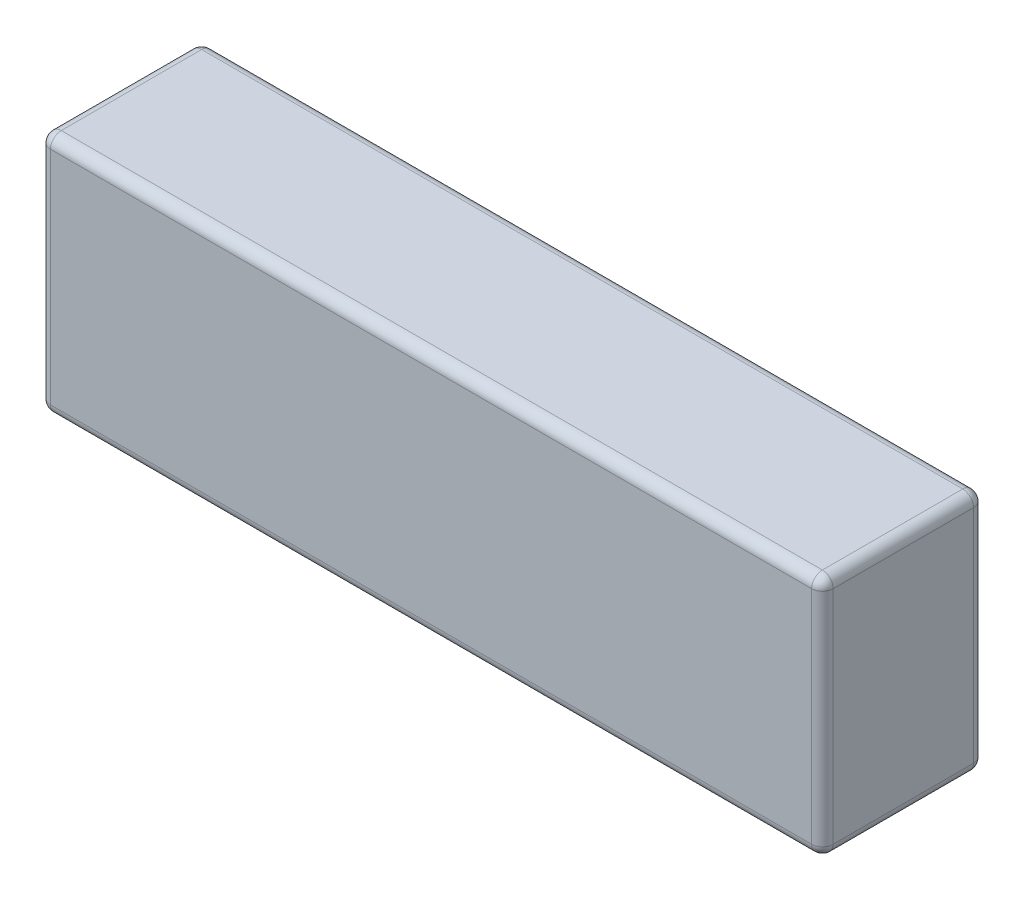
ISO-10303-21;
HEADER;
FILE_DESCRIPTION(('STEP AP214'),'2;1');
FILE_NAME('part.step','',(''),(''),'','','');
FILE_SCHEMA(('AUTOMOTIVE_DESIGN { 1 0 10303 214 1 1 1 1 }'));
ENDSEC;
DATA;
#1=APPLICATION_CONTEXT('core data for automotive mechanical design processes');
#2=APPLICATION_PROTOCOL_DEFINITION('international standard','automotive_design',2000,#1);
#3=PRODUCT_CONTEXT('',#1,'mechanical');
#4=PRODUCT('Part','Part','',(#3));
#5=PRODUCT_RELATED_PRODUCT_CATEGORY('part','',(#4));
#6=PRODUCT_DEFINITION_FORMATION('','',#4);
#7=PRODUCT_DEFINITION_CONTEXT('part definition',#1,'design');
#8=PRODUCT_DEFINITION('design','',#6,#7);
#9=PRODUCT_DEFINITION_SHAPE('','',#8);
#10=(LENGTH_UNIT() NAMED_UNIT(*) SI_UNIT(.MILLI.,.METRE.));
#11=(NAMED_UNIT(*) PLANE_ANGLE_UNIT() SI_UNIT($,.RADIAN.));
#12=(NAMED_UNIT(*) SI_UNIT($,.STERADIAN.) SOLID_ANGLE_UNIT());
#13=UNCERTAINTY_MEASURE_WITH_UNIT(LENGTH_MEASURE(1.E-05),#10,'distance_accuracy_value','');
#14=(GEOMETRIC_REPRESENTATION_CONTEXT(3) GLOBAL_UNCERTAINTY_ASSIGNED_CONTEXT((#13)) GLOBAL_UNIT_ASSIGNED_CONTEXT((#10,
#11,#12)) REPRESENTATION_CONTEXT('',''));
#15=CARTESIAN_POINT('',(0.,0.,0.));
#16=DIRECTION('',(0.,0.,1.));
#17=DIRECTION('',(1.,0.,0.));
#18=AXIS2_PLACEMENT_3D('',#15,#16,#17);
#19=CARTESIAN_POINT('',(0.,0.,30.));
#20=DIRECTION('',(1.,0.,0.));
#21=DIRECTION('',(0.,0.,-1.));
#22=AXIS2_PLACEMENT_3D('',#19,#20,#21);
#23=PLANE('',#22);
#24=DIRECTION('',(0.,-1.,0.));
#25=VECTOR('',#24,1.);
#26=CARTESIAN_POINT('',(0.,0.,2.));
#27=LINE('',#26,#25);
#28=CARTESIAN_POINT('',(0.,43.,2.));
#29=VERTEX_POINT('',#28);
#30=CARTESIAN_POINT('',(0.,2.,2.));
#31=VERTEX_POINT('',#30);
#32=EDGE_CURVE('E169',#29,#31,#27,.T.);
#33=ORIENTED_EDGE('',*,*,#32,.T.);
#34=DIRECTION('',(0.,0.,-1.));
#35=VECTOR('',#34,1.);
#36=CARTESIAN_POINT('',(0.,2.,30.));
#37=LINE('',#36,#35);
#38=CARTESIAN_POINT('',(0.,2.,28.));
#39=VERTEX_POINT('',#38);
#40=EDGE_CURVE('E171',#31,#39,#37,.F.);
#41=ORIENTED_EDGE('',*,*,#40,.T.);
#42=DIRECTION('',(0.,-1.,0.));
#43=VECTOR('',#42,1.);
#44=CARTESIAN_POINT('',(0.,0.,28.));
#45=LINE('',#44,#43);
#46=CARTESIAN_POINT('',(0.,43.,28.));
#47=VERTEX_POINT('',#46);
#48=EDGE_CURVE('E165',#39,#47,#45,.F.);
#49=ORIENTED_EDGE('',*,*,#48,.T.);
#50=DIRECTION('',(0.,0.,-1.));
#51=VECTOR('',#50,1.);
#52=CARTESIAN_POINT('',(0.,43.,30.));
#53=LINE('',#52,#51);
#54=EDGE_CURVE('E167',#47,#29,#53,.T.);
#55=ORIENTED_EDGE('',*,*,#54,.T.);
#56=EDGE_LOOP('',(#33,#41,#49,#55));
#57=FACE_BOUND('',#56,.T.);
#58=ADVANCED_FACE('F34',(#57),#23,.F.);
#59=CARTESIAN_POINT('',(0.,0.,30.));
#60=DIRECTION('',(0.,1.,0.));
#61=DIRECTION('',(0.,0.,1.));
#62=AXIS2_PLACEMENT_3D('',#59,#60,#61);
#63=PLANE('',#62);
#64=DIRECTION('',(0.,0.,-1.));
#65=VECTOR('',#64,1.);
#66=CARTESIAN_POINT('',(2.,0.,30.));
#67=LINE('',#66,#65);
#68=CARTESIAN_POINT('',(2.,0.,28.));
#69=VERTEX_POINT('',#68);
#70=CARTESIAN_POINT('',(2.,0.,2.));
#71=VERTEX_POINT('',#70);
#72=EDGE_CURVE('E133',#69,#71,#67,.T.);
#73=ORIENTED_EDGE('',*,*,#72,.T.);
#74=DIRECTION('',(1.,0.,0.));
#75=VECTOR('',#74,1.);
#76=CARTESIAN_POINT('',(145.,0.,2.));
#77=LINE('',#76,#75);
#78=CARTESIAN_POINT('',(143.,0.,2.));
#79=VERTEX_POINT('',#78);
#80=EDGE_CURVE('E129',#71,#79,#77,.T.);
#81=ORIENTED_EDGE('',*,*,#80,.T.);
#82=DIRECTION('',(0.,0.,-1.));
#83=VECTOR('',#82,1.);
#84=CARTESIAN_POINT('',(143.,0.,30.));
#85=LINE('',#84,#83);
#86=CARTESIAN_POINT('',(143.,0.,28.));
#87=VERTEX_POINT('',#86);
#88=EDGE_CURVE('E121',#79,#87,#85,.F.);
#89=ORIENTED_EDGE('',*,*,#88,.T.);
#90=DIRECTION('',(1.,0.,0.));
#91=VECTOR('',#90,1.);
#92=CARTESIAN_POINT('',(0.,0.,28.));
#93=LINE('',#92,#91);
#94=EDGE_CURVE('E126',#87,#69,#93,.F.);
#95=ORIENTED_EDGE('',*,*,#94,.T.);
#96=EDGE_LOOP('',(#73,#81,#89,#95));
#97=FACE_BOUND('',#96,.T.);
#98=ADVANCED_FACE('F124',(#97),#63,.F.);
#99=CARTESIAN_POINT('',(145.,0.,30.));
#100=DIRECTION('',(-1.,0.,0.));
#101=DIRECTION('',(0.,0.,1.));
#102=AXIS2_PLACEMENT_3D('',#99,#100,#101);
#103=PLANE('',#102);
#104=DIRECTION('',(0.,1.,0.));
#105=VECTOR('',#104,1.);
#106=CARTESIAN_POINT('',(145.,0.,28.));
#107=LINE('',#106,#105);
#108=CARTESIAN_POINT('',(145.,43.,28.));
#109=VERTEX_POINT('',#108);
#110=CARTESIAN_POINT('',(145.,2.,28.));
#111=VERTEX_POINT('',#110);
#112=EDGE_CURVE('E174',#109,#111,#107,.F.);
#113=ORIENTED_EDGE('',*,*,#112,.T.);
#114=DIRECTION('',(0.,0.,-1.));
#115=VECTOR('',#114,1.);
#116=CARTESIAN_POINT('',(145.,2.,30.));
#117=LINE('',#116,#115);
#118=CARTESIAN_POINT('',(145.,2.,2.));
#119=VERTEX_POINT('',#118);
#120=EDGE_CURVE('E141',#111,#119,#117,.T.);
#121=ORIENTED_EDGE('',*,*,#120,.T.);
#122=DIRECTION('',(0.,1.,0.));
#123=VECTOR('',#122,1.);
#124=CARTESIAN_POINT('',(145.,45.,2.));
#125=LINE('',#124,#123);
#126=CARTESIAN_POINT('',(145.,43.,2.));
#127=VERTEX_POINT('',#126);
#128=EDGE_CURVE('E178',#119,#127,#125,.T.);
#129=ORIENTED_EDGE('',*,*,#128,.T.);
#130=DIRECTION('',(0.,0.,-1.));
#131=VECTOR('',#130,1.);
#132=CARTESIAN_POINT('',(145.,43.,30.));
#133=LINE('',#132,#131);
#134=EDGE_CURVE('E176',#127,#109,#133,.F.);
#135=ORIENTED_EDGE('',*,*,#134,.T.);
#136=EDGE_LOOP('',(#113,#121,#129,#135));
#137=FACE_BOUND('',#136,.T.);
#138=ADVANCED_FACE('F325',(#137),#103,.F.);
#139=CARTESIAN_POINT('',(0.,45.,30.));
#140=DIRECTION('',(0.,-1.,0.));
#141=DIRECTION('',(0.,0.,-1.));
#142=AXIS2_PLACEMENT_3D('',#139,#140,#141);
#143=PLANE('',#142);
#144=DIRECTION('',(0.,0.,-1.));
#145=VECTOR('',#144,1.);
#146=CARTESIAN_POINT('',(143.,45.,30.));
#147=LINE('',#146,#145);
#148=CARTESIAN_POINT('',(143.,45.,28.));
#149=VERTEX_POINT('',#148);
#150=CARTESIAN_POINT('',(143.,45.,2.));
#151=VERTEX_POINT('',#150);
#152=EDGE_CURVE('E194',#149,#151,#147,.T.);
#153=ORIENTED_EDGE('',*,*,#152,.T.);
#154=DIRECTION('',(-1.,0.,0.));
#155=VECTOR('',#154,1.);
#156=CARTESIAN_POINT('',(0.,45.,2.));
#157=LINE('',#156,#155);
#158=CARTESIAN_POINT('',(2.,45.,2.));
#159=VERTEX_POINT('',#158);
#160=EDGE_CURVE('E197',#151,#159,#157,.T.);
#161=ORIENTED_EDGE('',*,*,#160,.T.);
#162=DIRECTION('',(0.,0.,-1.));
#163=VECTOR('',#162,1.);
#164=CARTESIAN_POINT('',(2.,45.,30.));
#165=LINE('',#164,#163);
#166=CARTESIAN_POINT('',(2.,45.,28.));
#167=VERTEX_POINT('',#166);
#168=EDGE_CURVE('E192',#159,#167,#165,.F.);
#169=ORIENTED_EDGE('',*,*,#168,.T.);
#170=DIRECTION('',(-1.,0.,0.));
#171=VECTOR('',#170,1.);
#172=CARTESIAN_POINT('',(0.,45.,28.));
#173=LINE('',#172,#171);
#174=EDGE_CURVE('E190',#167,#149,#173,.F.);
#175=ORIENTED_EDGE('',*,*,#174,.T.);
#176=EDGE_LOOP('',(#153,#161,#169,#175));
#177=FACE_BOUND('',#176,.T.);
#178=ADVANCED_FACE('F274',(#177),#143,.F.);
#179=CARTESIAN_POINT('',(0.,0.,30.));
#180=DIRECTION('',(0.,0.,-1.));
#181=DIRECTION('',(-1.,0.,0.));
#182=AXIS2_PLACEMENT_3D('',#179,#180,#181);
#183=PLANE('',#182);
#184=DIRECTION('',(0.,1.,0.));
#185=VECTOR('',#184,1.);
#186=CARTESIAN_POINT('',(143.,0.,30.));
#187=LINE('',#186,#185);
#188=CARTESIAN_POINT('',(143.,2.,30.));
#189=VERTEX_POINT('',#188);
#190=CARTESIAN_POINT('',(143.,43.,30.));
#191=VERTEX_POINT('',#190);
#192=EDGE_CURVE('E43',#189,#191,#187,.T.);
#193=ORIENTED_EDGE('',*,*,#192,.T.);
#194=DIRECTION('',(-1.,0.,0.));
#195=VECTOR('',#194,1.);
#196=CARTESIAN_POINT('',(0.,43.,30.));
#197=LINE('',#196,#195);
#198=CARTESIAN_POINT('',(2.,43.,30.));
#199=VERTEX_POINT('',#198);
#200=EDGE_CURVE('E11',#191,#199,#197,.T.);
#201=ORIENTED_EDGE('',*,*,#200,.T.);
#202=DIRECTION('',(0.,-1.,0.));
#203=VECTOR('',#202,1.);
#204=CARTESIAN_POINT('',(2.,0.,30.));
#205=LINE('',#204,#203);
#206=CARTESIAN_POINT('',(2.,2.,30.));
#207=VERTEX_POINT('',#206);
#208=EDGE_CURVE('E199',#199,#207,#205,.T.);
#209=ORIENTED_EDGE('',*,*,#208,.T.);
#210=DIRECTION('',(1.,0.,0.));
#211=VECTOR('',#210,1.);
#212=CARTESIAN_POINT('',(0.,2.,30.));
#213=LINE('',#212,#211);
#214=EDGE_CURVE('E54',#207,#189,#213,.T.);
#215=ORIENTED_EDGE('',*,*,#214,.T.);
#216=EDGE_LOOP('',(#193,#201,#209,#215));
#217=FACE_BOUND('',#216,.T.);
#218=ADVANCED_FACE('F289',(#217),#183,.F.);
#219=CARTESIAN_POINT('',(0.,0.,0.));
#220=DIRECTION('',(0.,0.,-1.));
#221=DIRECTION('',(-1.,0.,0.));
#222=AXIS2_PLACEMENT_3D('',#219,#220,#221);
#223=PLANE('',#222);
#224=DIRECTION('',(0.,1.,0.));
#225=VECTOR('',#224,1.);
#226=CARTESIAN_POINT('',(143.,0.,0.));
#227=LINE('',#226,#225);
#228=CARTESIAN_POINT('',(143.,43.,0.));
#229=VERTEX_POINT('',#228);
#230=CARTESIAN_POINT('',(143.,2.,0.));
#231=VERTEX_POINT('',#230);
#232=EDGE_CURVE('E185',#229,#231,#227,.F.);
#233=ORIENTED_EDGE('',*,*,#232,.T.);
#234=DIRECTION('',(1.,0.,0.));
#235=VECTOR('',#234,1.);
#236=CARTESIAN_POINT('',(0.,2.,0.));
#237=LINE('',#236,#235);
#238=CARTESIAN_POINT('',(2.,2.,0.));
#239=VERTEX_POINT('',#238);
#240=EDGE_CURVE('E187',#231,#239,#237,.F.);
#241=ORIENTED_EDGE('',*,*,#240,.T.);
#242=DIRECTION('',(0.,-1.,0.));
#243=VECTOR('',#242,1.);
#244=CARTESIAN_POINT('',(2.,45.,0.));
#245=LINE('',#244,#243);
#246=CARTESIAN_POINT('',(2.,43.,0.));
#247=VERTEX_POINT('',#246);
#248=EDGE_CURVE('E183',#239,#247,#245,.F.);
#249=ORIENTED_EDGE('',*,*,#248,.T.);
#250=DIRECTION('',(-1.,0.,0.));
#251=VECTOR('',#250,1.);
#252=CARTESIAN_POINT('',(145.,43.,0.));
#253=LINE('',#252,#251);
#254=EDGE_CURVE('E181',#247,#229,#253,.F.);
#255=ORIENTED_EDGE('',*,*,#254,.T.);
#256=EDGE_LOOP('',(#233,#241,#249,#255));
#257=FACE_BOUND('',#256,.T.);
#258=ADVANCED_FACE('F265',(#257),#223,.T.);
#259=CARTESIAN_POINT('',(143.,43.,30.));
#260=DIRECTION('',(0.,0.,-1.));
#261=DIRECTION('',(-1.,0.,0.));
#262=AXIS2_PLACEMENT_3D('',#259,#260,#261);
#263=CYLINDRICAL_SURFACE('',#262,2.);
#264=CARTESIAN_POINT('',(143.,43.,28.));
#265=DIRECTION('',(0.,0.,1.));
#266=DIRECTION('',(1.,0.,0.));
#267=AXIS2_PLACEMENT_3D('',#264,#265,#266);
#268=CIRCLE('',#267,2.);
#269=EDGE_CURVE('E38',#109,#149,#268,.T.);
#270=ORIENTED_EDGE('',*,*,#269,.F.);
#271=ORIENTED_EDGE('',*,*,#134,.F.);
#272=CARTESIAN_POINT('',(143.,43.,2.));
#273=DIRECTION('',(0.,0.,-1.));
#274=DIRECTION('',(-1.,0.,0.));
#275=AXIS2_PLACEMENT_3D('',#272,#273,#274);
#276=CIRCLE('',#275,2.);
#277=EDGE_CURVE('E161',#151,#127,#276,.T.);
#278=ORIENTED_EDGE('',*,*,#277,.F.);
#279=ORIENTED_EDGE('',*,*,#152,.F.);
#280=EDGE_LOOP('',(#270,#271,#278,#279));
#281=FACE_BOUND('',#280,.T.);
#282=ADVANCED_FACE('F36',(#281),#263,.T.);
#283=CARTESIAN_POINT('',(143.,43.,28.));
#284=DIRECTION('',(0.,0.,1.));
#285=DIRECTION('',(1.,0.,0.));
#286=AXIS2_PLACEMENT_3D('',#283,#284,#285);
#287=SPHERICAL_SURFACE('',#286,2.);
#288=CARTESIAN_POINT('',(143.,43.,28.));
#289=DIRECTION('',(0.,1.,0.));
#290=DIRECTION('',(0.,0.,1.));
#291=AXIS2_PLACEMENT_3D('',#288,#289,#290);
#292=CIRCLE('',#291,2.);
#293=EDGE_CURVE('E245',#109,#191,#292,.F.);
#294=ORIENTED_EDGE('',*,*,#293,.F.);
#295=ORIENTED_EDGE('',*,*,#269,.T.);
#296=CARTESIAN_POINT('',(143.,43.,28.));
#297=DIRECTION('',(1.,0.,0.));
#298=DIRECTION('',(0.,0.,-1.));
#299=AXIS2_PLACEMENT_3D('',#296,#297,#298);
#300=CIRCLE('',#299,2.);
#301=EDGE_CURVE('E247',#191,#149,#300,.F.);
#302=ORIENTED_EDGE('',*,*,#301,.F.);
#303=EDGE_LOOP('',(#294,#295,#302));
#304=FACE_BOUND('',#303,.T.);
#305=ADVANCED_FACE('F458',(#304),#287,.T.);
#306=CARTESIAN_POINT('',(143.,43.,2.));
#307=DIRECTION('',(0.,0.,1.));
#308=DIRECTION('',(1.,0.,0.));
#309=AXIS2_PLACEMENT_3D('',#306,#307,#308);
#310=SPHERICAL_SURFACE('',#309,2.);
#311=CARTESIAN_POINT('',(143.,43.,2.));
#312=DIRECTION('',(1.,0.,0.));
#313=DIRECTION('',(0.,0.,-1.));
#314=AXIS2_PLACEMENT_3D('',#311,#312,#313);
#315=CIRCLE('',#314,2.);
#316=EDGE_CURVE('E239',#151,#229,#315,.F.);
#317=ORIENTED_EDGE('',*,*,#316,.F.);
#318=ORIENTED_EDGE('',*,*,#277,.T.);
#319=CARTESIAN_POINT('',(143.,43.,2.));
#320=DIRECTION('',(0.,1.,0.));
#321=DIRECTION('',(0.,0.,1.));
#322=AXIS2_PLACEMENT_3D('',#319,#320,#321);
#323=CIRCLE('',#322,2.);
#324=EDGE_CURVE('E242',#229,#127,#323,.F.);
#325=ORIENTED_EDGE('',*,*,#324,.F.);
#326=EDGE_LOOP('',(#317,#318,#325));
#327=FACE_BOUND('',#326,.T.);
#328=ADVANCED_FACE('F254',(#327),#310,.T.);
#329=CARTESIAN_POINT('',(0.,43.,28.));
#330=DIRECTION('',(-1.,0.,0.));
#331=DIRECTION('',(0.,0.,1.));
#332=AXIS2_PLACEMENT_3D('',#329,#330,#331);
#333=CYLINDRICAL_SURFACE('',#332,2.);
#334=ORIENTED_EDGE('',*,*,#301,.T.);
#335=ORIENTED_EDGE('',*,*,#174,.F.);
#336=CARTESIAN_POINT('',(2.,43.,28.));
#337=DIRECTION('',(-1.,0.,0.));
#338=DIRECTION('',(0.,0.,1.));
#339=AXIS2_PLACEMENT_3D('',#336,#337,#338);
#340=CIRCLE('',#339,2.);
#341=EDGE_CURVE('E233',#199,#167,#340,.T.);
#342=ORIENTED_EDGE('',*,*,#341,.F.);
#343=ORIENTED_EDGE('',*,*,#200,.F.);
#344=EDGE_LOOP('',(#334,#335,#342,#343));
#345=FACE_BOUND('',#344,.T.);
#346=ADVANCED_FACE('F288',(#345),#333,.T.);
#347=CARTESIAN_POINT('',(143.,0.,28.));
#348=DIRECTION('',(0.,1.,0.));
#349=DIRECTION('',(0.,0.,1.));
#350=AXIS2_PLACEMENT_3D('',#347,#348,#349);
#351=CYLINDRICAL_SURFACE('',#350,2.);
#352=ORIENTED_EDGE('',*,*,#293,.T.);
#353=ORIENTED_EDGE('',*,*,#192,.F.);
#354=CARTESIAN_POINT('',(143.,2.,28.));
#355=DIRECTION('',(0.,-1.,0.));
#356=DIRECTION('',(0.,0.,-1.));
#357=AXIS2_PLACEMENT_3D('',#354,#355,#356);
#358=CIRCLE('',#357,2.);
#359=EDGE_CURVE('E145',#111,#189,#358,.T.);
#360=ORIENTED_EDGE('',*,*,#359,.F.);
#361=ORIENTED_EDGE('',*,*,#112,.F.);
#362=EDGE_LOOP('',(#352,#353,#360,#361));
#363=FACE_BOUND('',#362,.T.);
#364=ADVANCED_FACE('F435',(#363),#351,.T.);
#365=CARTESIAN_POINT('',(143.,2.,30.));
#366=DIRECTION('',(0.,0.,-1.));
#367=DIRECTION('',(-1.,0.,0.));
#368=AXIS2_PLACEMENT_3D('',#365,#366,#367);
#369=CYLINDRICAL_SURFACE('',#368,2.);
#370=CARTESIAN_POINT('',(143.,2.,2.));
#371=DIRECTION('',(0.,0.,-1.));
#372=DIRECTION('',(-1.,0.,0.));
#373=AXIS2_PLACEMENT_3D('',#370,#371,#372);
#374=CIRCLE('',#373,2.);
#375=EDGE_CURVE('E146',#119,#79,#374,.T.);
#376=ORIENTED_EDGE('',*,*,#375,.F.);
#377=ORIENTED_EDGE('',*,*,#120,.F.);
#378=CARTESIAN_POINT('',(143.,2.,28.));
#379=DIRECTION('',(0.,0.,1.));
#380=DIRECTION('',(1.,0.,0.));
#381=AXIS2_PLACEMENT_3D('',#378,#379,#380);
#382=CIRCLE('',#381,2.);
#383=EDGE_CURVE('E137',#87,#111,#382,.T.);
#384=ORIENTED_EDGE('',*,*,#383,.F.);
#385=ORIENTED_EDGE('',*,*,#88,.F.);
#386=EDGE_LOOP('',(#376,#377,#384,#385));
#387=FACE_BOUND('',#386,.T.);
#388=ADVANCED_FACE('F139',(#387),#369,.T.);
#389=CARTESIAN_POINT('',(143.,0.,2.));
#390=DIRECTION('',(0.,-1.,0.));
#391=DIRECTION('',(0.,0.,-1.));
#392=AXIS2_PLACEMENT_3D('',#389,#390,#391);
#393=CYLINDRICAL_SURFACE('',#392,2.);
#394=ORIENTED_EDGE('',*,*,#324,.T.);
#395=ORIENTED_EDGE('',*,*,#128,.F.);
#396=CARTESIAN_POINT('',(143.,2.,2.));
#397=DIRECTION('',(0.,-1.,0.));
#398=DIRECTION('',(0.,0.,-1.));
#399=AXIS2_PLACEMENT_3D('',#396,#397,#398);
#400=CIRCLE('',#399,2.);
#401=EDGE_CURVE('E229',#231,#119,#400,.T.);
#402=ORIENTED_EDGE('',*,*,#401,.F.);
#403=ORIENTED_EDGE('',*,*,#232,.F.);
#404=EDGE_LOOP('',(#394,#395,#402,#403));
#405=FACE_BOUND('',#404,.T.);
#406=ADVANCED_FACE('F261',(#405),#393,.T.);
#407=CARTESIAN_POINT('',(0.,43.,2.));
#408=DIRECTION('',(1.,0.,0.));
#409=DIRECTION('',(0.,0.,-1.));
#410=AXIS2_PLACEMENT_3D('',#407,#408,#409);
#411=CYLINDRICAL_SURFACE('',#410,2.);
#412=ORIENTED_EDGE('',*,*,#316,.T.);
#413=ORIENTED_EDGE('',*,*,#254,.F.);
#414=CARTESIAN_POINT('',(2.,43.,2.));
#415=DIRECTION('',(-1.,0.,0.));
#416=DIRECTION('',(0.,0.,1.));
#417=AXIS2_PLACEMENT_3D('',#414,#415,#416);
#418=CIRCLE('',#417,2.);
#419=EDGE_CURVE('E226',#159,#247,#418,.T.);
#420=ORIENTED_EDGE('',*,*,#419,.F.);
#421=ORIENTED_EDGE('',*,*,#160,.F.);
#422=EDGE_LOOP('',(#412,#413,#420,#421));
#423=FACE_BOUND('',#422,.T.);
#424=ADVANCED_FACE('F271',(#423),#411,.T.);
#425=CARTESIAN_POINT('',(2.,43.,30.));
#426=DIRECTION('',(0.,0.,-1.));
#427=DIRECTION('',(-1.,0.,0.));
#428=AXIS2_PLACEMENT_3D('',#425,#426,#427);
#429=CYLINDRICAL_SURFACE('',#428,2.);
#430=CARTESIAN_POINT('',(2.,43.,28.));
#431=DIRECTION('',(0.,0.,1.));
#432=DIRECTION('',(1.,0.,0.));
#433=AXIS2_PLACEMENT_3D('',#430,#431,#432);
#434=CIRCLE('',#433,2.);
#435=EDGE_CURVE('E236',#167,#47,#434,.T.);
#436=ORIENTED_EDGE('',*,*,#435,.F.);
#437=ORIENTED_EDGE('',*,*,#168,.F.);
#438=CARTESIAN_POINT('',(2.,43.,2.));
#439=DIRECTION('',(0.,0.,-1.));
#440=DIRECTION('',(-1.,0.,0.));
#441=AXIS2_PLACEMENT_3D('',#438,#439,#440);
#442=CIRCLE('',#441,2.);
#443=EDGE_CURVE('E223',#29,#159,#442,.T.);
#444=ORIENTED_EDGE('',*,*,#443,.F.);
#445=ORIENTED_EDGE('',*,*,#54,.F.);
#446=EDGE_LOOP('',(#436,#437,#444,#445));
#447=FACE_BOUND('',#446,.T.);
#448=ADVANCED_FACE('F279',(#447),#429,.T.);
#449=CARTESIAN_POINT('',(2.,43.,28.));
#450=DIRECTION('',(0.,0.,1.));
#451=DIRECTION('',(1.,0.,0.));
#452=AXIS2_PLACEMENT_3D('',#449,#450,#451);
#453=SPHERICAL_SURFACE('',#452,2.);
#454=ORIENTED_EDGE('',*,*,#341,.T.);
#455=ORIENTED_EDGE('',*,*,#435,.T.);
#456=CARTESIAN_POINT('',(2.,43.,28.));
#457=DIRECTION('',(0.,1.,0.));
#458=DIRECTION('',(0.,0.,1.));
#459=AXIS2_PLACEMENT_3D('',#456,#457,#458);
#460=CIRCLE('',#459,2.);
#461=EDGE_CURVE('E152',#199,#47,#460,.F.);
#462=ORIENTED_EDGE('',*,*,#461,.F.);
#463=EDGE_LOOP('',(#454,#455,#462));
#464=FACE_BOUND('',#463,.T.);
#465=ADVANCED_FACE('F285',(#464),#453,.T.);
#466=CARTESIAN_POINT('',(143.,2.,28.));
#467=DIRECTION('',(0.,0.,1.));
#468=DIRECTION('',(1.,0.,0.));
#469=AXIS2_PLACEMENT_3D('',#466,#467,#468);
#470=SPHERICAL_SURFACE('',#469,2.);
#471=ORIENTED_EDGE('',*,*,#383,.T.);
#472=ORIENTED_EDGE('',*,*,#359,.T.);
#473=CARTESIAN_POINT('',(143.,2.,28.));
#474=DIRECTION('',(1.,0.,0.));
#475=DIRECTION('',(0.,0.,-1.));
#476=AXIS2_PLACEMENT_3D('',#473,#474,#475);
#477=CIRCLE('',#476,2.);
#478=EDGE_CURVE('E149',#87,#189,#477,.F.);
#479=ORIENTED_EDGE('',*,*,#478,.F.);
#480=EDGE_LOOP('',(#471,#472,#479));
#481=FACE_BOUND('',#480,.T.);
#482=ADVANCED_FACE('F150',(#481),#470,.T.);
#483=CARTESIAN_POINT('',(143.,2.,2.));
#484=DIRECTION('',(0.,0.,1.));
#485=DIRECTION('',(1.,0.,0.));
#486=AXIS2_PLACEMENT_3D('',#483,#484,#485);
#487=SPHERICAL_SURFACE('',#486,2.);
#488=ORIENTED_EDGE('',*,*,#401,.T.);
#489=ORIENTED_EDGE('',*,*,#375,.T.);
#490=CARTESIAN_POINT('',(143.,2.,2.));
#491=DIRECTION('',(1.,0.,0.));
#492=DIRECTION('',(0.,0.,-1.));
#493=AXIS2_PLACEMENT_3D('',#490,#491,#492);
#494=CIRCLE('',#493,2.);
#495=EDGE_CURVE('E153',#231,#79,#494,.F.);
#496=ORIENTED_EDGE('',*,*,#495,.F.);
#497=EDGE_LOOP('',(#488,#489,#496));
#498=FACE_BOUND('',#497,.T.);
#499=ADVANCED_FACE('F308',(#498),#487,.T.);
#500=CARTESIAN_POINT('',(2.,43.,2.));
#501=DIRECTION('',(0.,0.,1.));
#502=DIRECTION('',(1.,0.,0.));
#503=AXIS2_PLACEMENT_3D('',#500,#501,#502);
#504=SPHERICAL_SURFACE('',#503,2.);
#505=ORIENTED_EDGE('',*,*,#443,.T.);
#506=ORIENTED_EDGE('',*,*,#419,.T.);
#507=CARTESIAN_POINT('',(2.,43.,2.));
#508=DIRECTION('',(0.,1.,0.));
#509=DIRECTION('',(0.,0.,1.));
#510=AXIS2_PLACEMENT_3D('',#507,#508,#509);
#511=CIRCLE('',#510,2.);
#512=EDGE_CURVE('E216',#29,#247,#511,.F.);
#513=ORIENTED_EDGE('',*,*,#512,.F.);
#514=EDGE_LOOP('',(#505,#506,#513));
#515=FACE_BOUND('',#514,.T.);
#516=ADVANCED_FACE('F310',(#515),#504,.T.);
#517=CARTESIAN_POINT('',(2.,0.,28.));
#518=DIRECTION('',(0.,-1.,0.));
#519=DIRECTION('',(0.,0.,-1.));
#520=AXIS2_PLACEMENT_3D('',#517,#518,#519);
#521=CYLINDRICAL_SURFACE('',#520,2.);
#522=ORIENTED_EDGE('',*,*,#461,.T.);
#523=ORIENTED_EDGE('',*,*,#48,.F.);
#524=CARTESIAN_POINT('',(2.,2.,28.));
#525=DIRECTION('',(0.,-1.,0.));
#526=DIRECTION('',(0.,0.,-1.));
#527=AXIS2_PLACEMENT_3D('',#524,#525,#526);
#528=CIRCLE('',#527,2.);
#529=EDGE_CURVE('E213',#207,#39,#528,.T.);
#530=ORIENTED_EDGE('',*,*,#529,.F.);
#531=ORIENTED_EDGE('',*,*,#208,.F.);
#532=EDGE_LOOP('',(#522,#523,#530,#531));
#533=FACE_BOUND('',#532,.T.);
#534=ADVANCED_FACE('F293',(#533),#521,.T.);
#535=CARTESIAN_POINT('',(0.,2.,28.));
#536=DIRECTION('',(1.,0.,0.));
#537=DIRECTION('',(0.,0.,-1.));
#538=AXIS2_PLACEMENT_3D('',#535,#536,#537);
#539=CYLINDRICAL_SURFACE('',#538,2.);
#540=ORIENTED_EDGE('',*,*,#478,.T.);
#541=ORIENTED_EDGE('',*,*,#214,.F.);
#542=CARTESIAN_POINT('',(2.,2.,28.));
#543=DIRECTION('',(-1.,0.,0.));
#544=DIRECTION('',(0.,0.,1.));
#545=AXIS2_PLACEMENT_3D('',#542,#543,#544);
#546=CIRCLE('',#545,2.);
#547=EDGE_CURVE('E157',#69,#207,#546,.T.);
#548=ORIENTED_EDGE('',*,*,#547,.F.);
#549=ORIENTED_EDGE('',*,*,#94,.F.);
#550=EDGE_LOOP('',(#540,#541,#548,#549));
#551=FACE_BOUND('',#550,.T.);
#552=ADVANCED_FACE('F155',(#551),#539,.T.);
#553=CARTESIAN_POINT('',(0.,2.,2.));
#554=DIRECTION('',(-1.,0.,0.));
#555=DIRECTION('',(0.,0.,1.));
#556=AXIS2_PLACEMENT_3D('',#553,#554,#555);
#557=CYLINDRICAL_SURFACE('',#556,2.);
#558=ORIENTED_EDGE('',*,*,#495,.T.);
#559=ORIENTED_EDGE('',*,*,#80,.F.);
#560=CARTESIAN_POINT('',(2.,2.,2.));
#561=DIRECTION('',(-1.,0.,0.));
#562=DIRECTION('',(0.,0.,1.));
#563=AXIS2_PLACEMENT_3D('',#560,#561,#562);
#564=CIRCLE('',#563,2.);
#565=EDGE_CURVE('E209',#239,#71,#564,.T.);
#566=ORIENTED_EDGE('',*,*,#565,.F.);
#567=ORIENTED_EDGE('',*,*,#240,.F.);
#568=EDGE_LOOP('',(#558,#559,#566,#567));
#569=FACE_BOUND('',#568,.T.);
#570=ADVANCED_FACE('F306',(#569),#557,.T.);
#571=CARTESIAN_POINT('',(2.,0.,2.));
#572=DIRECTION('',(0.,1.,0.));
#573=DIRECTION('',(0.,0.,1.));
#574=AXIS2_PLACEMENT_3D('',#571,#572,#573);
#575=CYLINDRICAL_SURFACE('',#574,2.);
#576=ORIENTED_EDGE('',*,*,#512,.T.);
#577=ORIENTED_EDGE('',*,*,#248,.F.);
#578=CARTESIAN_POINT('',(2.,2.,2.));
#579=DIRECTION('',(0.,-1.,0.));
#580=DIRECTION('',(0.,0.,-1.));
#581=AXIS2_PLACEMENT_3D('',#578,#579,#580);
#582=CIRCLE('',#581,2.);
#583=EDGE_CURVE('E207',#31,#239,#582,.T.);
#584=ORIENTED_EDGE('',*,*,#583,.F.);
#585=ORIENTED_EDGE('',*,*,#32,.F.);
#586=EDGE_LOOP('',(#576,#577,#584,#585));
#587=FACE_BOUND('',#586,.T.);
#588=ADVANCED_FACE('F335',(#587),#575,.T.);
#589=CARTESIAN_POINT('',(2.,2.,28.));
#590=DIRECTION('',(0.,0.,1.));
#591=DIRECTION('',(1.,0.,0.));
#592=AXIS2_PLACEMENT_3D('',#589,#590,#591);
#593=SPHERICAL_SURFACE('',#592,2.);
#594=ORIENTED_EDGE('',*,*,#547,.T.);
#595=ORIENTED_EDGE('',*,*,#529,.T.);
#596=CARTESIAN_POINT('',(2.,2.,28.));
#597=DIRECTION('',(0.,0.,1.));
#598=DIRECTION('',(1.,0.,0.));
#599=AXIS2_PLACEMENT_3D('',#596,#597,#598);
#600=CIRCLE('',#599,2.);
#601=EDGE_CURVE('E205',#69,#39,#600,.F.);
#602=ORIENTED_EDGE('',*,*,#601,.F.);
#603=EDGE_LOOP('',(#594,#595,#602));
#604=FACE_BOUND('',#603,.T.);
#605=ADVANCED_FACE('F295',(#604),#593,.T.);
#606=CARTESIAN_POINT('',(2.,2.,2.));
#607=DIRECTION('',(0.,0.,1.));
#608=DIRECTION('',(1.,0.,0.));
#609=AXIS2_PLACEMENT_3D('',#606,#607,#608);
#610=SPHERICAL_SURFACE('',#609,2.);
#611=ORIENTED_EDGE('',*,*,#583,.T.);
#612=ORIENTED_EDGE('',*,*,#565,.T.);
#613=CARTESIAN_POINT('',(2.,2.,2.));
#614=DIRECTION('',(0.,0.,-1.));
#615=DIRECTION('',(-1.,0.,0.));
#616=AXIS2_PLACEMENT_3D('',#613,#614,#615);
#617=CIRCLE('',#616,2.);
#618=EDGE_CURVE('E203',#31,#71,#617,.F.);
#619=ORIENTED_EDGE('',*,*,#618,.F.);
#620=EDGE_LOOP('',(#611,#612,#619));
#621=FACE_BOUND('',#620,.T.);
#622=ADVANCED_FACE('F303',(#621),#610,.T.);
#623=CARTESIAN_POINT('',(2.,2.,30.));
#624=DIRECTION('',(0.,0.,-1.));
#625=DIRECTION('',(-1.,0.,0.));
#626=AXIS2_PLACEMENT_3D('',#623,#624,#625);
#627=CYLINDRICAL_SURFACE('',#626,2.);
#628=ORIENTED_EDGE('',*,*,#601,.T.);
#629=ORIENTED_EDGE('',*,*,#40,.F.);
#630=ORIENTED_EDGE('',*,*,#618,.T.);
#631=ORIENTED_EDGE('',*,*,#72,.F.);
#632=EDGE_LOOP('',(#628,#629,#630,#631));
#633=FACE_BOUND('',#632,.T.);
#634=ADVANCED_FACE('F299',(#633),#627,.T.);
#635=CLOSED_SHELL('',(#58,#98,#138,#178,#218,#258,#282,#305,#328,#346,#364,#388,#406,#424,#448,
#465,#482,#499,#516,#534,#552,#570,#588,#605,#622,#634));
#636=MANIFOLD_SOLID_BREP('B2',#635);
#637=ADVANCED_BREP_SHAPE_REPRESENTATION('',(#18,#636),#14);
#638=SHAPE_DEFINITION_REPRESENTATION(#9,#637);
ENDSEC;
END-ISO-10303-21;
